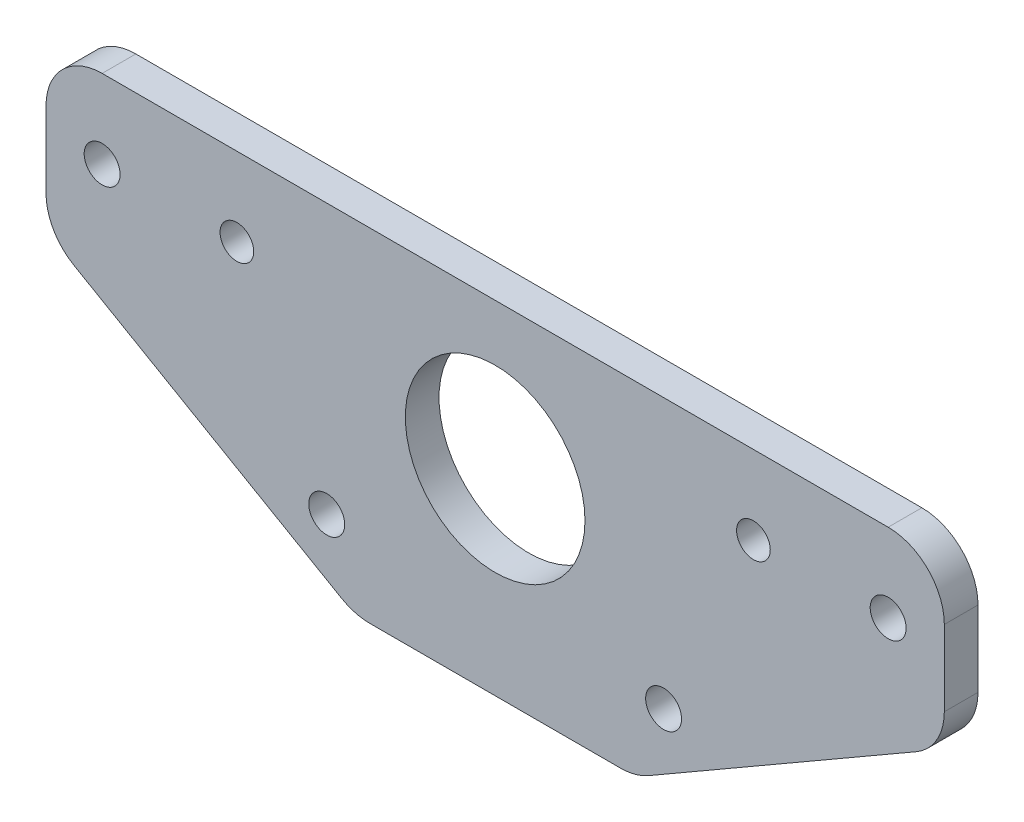
ISO-10303-21;
HEADER;
FILE_DESCRIPTION(('STEP AP214'),'2;1');
FILE_NAME('part.step','',(''),(''),'','','');
FILE_SCHEMA(('AUTOMOTIVE_DESIGN { 1 0 10303 214 1 1 1 1 }'));
ENDSEC;
DATA;
#1=APPLICATION_CONTEXT('core data for automotive mechanical design processes');
#2=APPLICATION_PROTOCOL_DEFINITION('international standard','automotive_design',2000,#1);
#3=PRODUCT_CONTEXT('',#1,'mechanical');
#4=PRODUCT('Part','Part','',(#3));
#5=PRODUCT_RELATED_PRODUCT_CATEGORY('part','',(#4));
#6=PRODUCT_DEFINITION_FORMATION('','',#4);
#7=PRODUCT_DEFINITION_CONTEXT('part definition',#1,'design');
#8=PRODUCT_DEFINITION('design','',#6,#7);
#9=PRODUCT_DEFINITION_SHAPE('','',#8);
#10=(LENGTH_UNIT() NAMED_UNIT(*) SI_UNIT(.MILLI.,.METRE.));
#11=(NAMED_UNIT(*) PLANE_ANGLE_UNIT() SI_UNIT($,.RADIAN.));
#12=(NAMED_UNIT(*) SI_UNIT($,.STERADIAN.) SOLID_ANGLE_UNIT());
#13=UNCERTAINTY_MEASURE_WITH_UNIT(LENGTH_MEASURE(1.E-05),#10,'distance_accuracy_value','');
#14=(GEOMETRIC_REPRESENTATION_CONTEXT(3) GLOBAL_UNCERTAINTY_ASSIGNED_CONTEXT((#13)) GLOBAL_UNIT_ASSIGNED_CONTEXT((#10,
#11,#12)) REPRESENTATION_CONTEXT('',''));
#15=CARTESIAN_POINT('',(0.,0.,0.));
#16=DIRECTION('',(0.,0.,1.));
#17=DIRECTION('',(1.,0.,0.));
#18=AXIS2_PLACEMENT_3D('',#15,#16,#17);
#19=CARTESIAN_POINT('',(35.,25.5,3.));
#20=DIRECTION('',(0.,0.,1.));
#21=DIRECTION('',(1.,0.,0.));
#22=AXIS2_PLACEMENT_3D('',#19,#20,#21);
#23=PLANE('',#22);
#24=CARTESIAN_POINT('',(-15.,6.50000000000001,3.));
#25=DIRECTION('',(0.,0.,1.));
#26=DIRECTION('',(1.,0.,0.));
#27=AXIS2_PLACEMENT_3D('',#24,#25,#26);
#28=CIRCLE('',#27,1.6);
#29=CARTESIAN_POINT('',(-13.4,6.50000000000001,3.));
#30=VERTEX_POINT('',#29);
#31=EDGE_CURVE('E472',#30,#30,#28,.T.);
#32=ORIENTED_EDGE('',*,*,#31,.F.);
#33=EDGE_LOOP('',(#32));
#34=FACE_BOUND('',#33,.T.);
#35=CARTESIAN_POINT('',(-35.,23.5,3.));
#36=DIRECTION('',(0.,0.,1.));
#37=DIRECTION('',(1.,0.,0.));
#38=AXIS2_PLACEMENT_3D('',#35,#36,#37);
#39=CIRCLE('',#38,1.6);
#40=CARTESIAN_POINT('',(-33.4,23.5,3.));
#41=VERTEX_POINT('',#40);
#42=EDGE_CURVE('E460',#41,#41,#39,.T.);
#43=ORIENTED_EDGE('',*,*,#42,.F.);
#44=EDGE_LOOP('',(#43));
#45=FACE_BOUND('',#44,.T.);
#46=CARTESIAN_POINT('',(-23.,23.5,3.));
#47=DIRECTION('',(0.,0.,1.));
#48=DIRECTION('',(1.,0.,0.));
#49=AXIS2_PLACEMENT_3D('',#46,#47,#48);
#50=CIRCLE('',#49,1.5);
#51=CARTESIAN_POINT('',(-21.5,23.5,3.));
#52=VERTEX_POINT('',#51);
#53=EDGE_CURVE('E446',#52,#52,#50,.T.);
#54=ORIENTED_EDGE('',*,*,#53,.F.);
#55=EDGE_LOOP('',(#54));
#56=FACE_BOUND('',#55,.T.);
#57=DIRECTION('',(0.,1.,0.));
#58=VECTOR('',#57,1.);
#59=CARTESIAN_POINT('',(-40.,15.8771324027148,3.));
#60=LINE('',#59,#58);
#61=CARTESIAN_POINT('',(-40.,18.7638837486629,3.));
#62=VERTEX_POINT('',#61);
#63=CARTESIAN_POINT('',(-40.,25.5,3.));
#64=VERTEX_POINT('',#63);
#65=EDGE_CURVE('E171',#62,#64,#60,.T.);
#66=ORIENTED_EDGE('',*,*,#65,.F.);
#67=CARTESIAN_POINT('',(-35.,18.7638837486629,3.));
#68=DIRECTION('',(0.,0.,1.));
#69=DIRECTION('',(1.,0.,0.));
#70=AXIS2_PLACEMENT_3D('',#67,#68,#69);
#71=CIRCLE('',#70,5.);
#72=CARTESIAN_POINT('',(-37.5,14.4337567297407,3.));
#73=VERTEX_POINT('',#72);
#74=EDGE_CURVE('E203',#62,#73,#71,.T.);
#75=ORIENTED_EDGE('',*,*,#74,.T.);
#76=DIRECTION('',(-0.866025403784438,0.500000000000001,0.));
#77=VECTOR('',#76,1.);
#78=CARTESIAN_POINT('',(-12.5,0.,3.));
#79=LINE('',#78,#77);
#80=CARTESIAN_POINT('',(-13.6602540378444,0.669872981077811,3.));
#81=VERTEX_POINT('',#80);
#82=EDGE_CURVE('E173',#81,#73,#79,.T.);
#83=ORIENTED_EDGE('',*,*,#82,.F.);
#84=CARTESIAN_POINT('',(-11.1602540378444,5.,3.));
#85=DIRECTION('',(0.,0.,1.));
#86=DIRECTION('',(1.,0.,0.));
#87=AXIS2_PLACEMENT_3D('',#84,#85,#86);
#88=CIRCLE('',#87,5.);
#89=CARTESIAN_POINT('',(-11.1602540378444,0.,3.));
#90=VERTEX_POINT('',#89);
#91=EDGE_CURVE('E50',#81,#90,#88,.T.);
#92=ORIENTED_EDGE('',*,*,#91,.T.);
#93=DIRECTION('',(1.,0.,0.));
#94=VECTOR('',#93,1.);
#95=CARTESIAN_POINT('',(-12.5,0.,3.));
#96=LINE('',#95,#94);
#97=CARTESIAN_POINT('',(11.1602540378444,0.,3.));
#98=VERTEX_POINT('',#97);
#99=EDGE_CURVE('E176',#90,#98,#96,.T.);
#100=ORIENTED_EDGE('',*,*,#99,.T.);
#101=CARTESIAN_POINT('',(11.1602540378444,5.,3.));
#102=DIRECTION('',(0.,0.,1.));
#103=DIRECTION('',(1.,0.,0.));
#104=AXIS2_PLACEMENT_3D('',#101,#102,#103);
#105=CIRCLE('',#104,5.);
#106=CARTESIAN_POINT('',(13.6602540378444,0.669872981077807,3.));
#107=VERTEX_POINT('',#106);
#108=EDGE_CURVE('E199',#98,#107,#105,.T.);
#109=ORIENTED_EDGE('',*,*,#108,.T.);
#110=DIRECTION('',(0.866025403784438,0.500000000000001,0.));
#111=VECTOR('',#110,1.);
#112=CARTESIAN_POINT('',(12.5,0.,3.));
#113=LINE('',#112,#111);
#114=CARTESIAN_POINT('',(37.5,14.4337567297407,3.));
#115=VERTEX_POINT('',#114);
#116=EDGE_CURVE('E159',#107,#115,#113,.T.);
#117=ORIENTED_EDGE('',*,*,#116,.T.);
#118=CARTESIAN_POINT('',(35.,18.7638837486629,3.));
#119=DIRECTION('',(0.,0.,1.));
#120=DIRECTION('',(1.,0.,0.));
#121=AXIS2_PLACEMENT_3D('',#118,#119,#120);
#122=CIRCLE('',#121,5.);
#123=CARTESIAN_POINT('',(40.,18.7638837486629,3.));
#124=VERTEX_POINT('',#123);
#125=EDGE_CURVE('E201',#115,#124,#122,.T.);
#126=ORIENTED_EDGE('',*,*,#125,.T.);
#127=DIRECTION('',(0.,1.,0.));
#128=VECTOR('',#127,1.);
#129=CARTESIAN_POINT('',(40.,15.8771324027147,3.));
#130=LINE('',#129,#128);
#131=CARTESIAN_POINT('',(40.,25.5,3.));
#132=VERTEX_POINT('',#131);
#133=EDGE_CURVE('E162',#124,#132,#130,.T.);
#134=ORIENTED_EDGE('',*,*,#133,.T.);
#135=CARTESIAN_POINT('',(35.,25.5,3.));
#136=DIRECTION('',(0.,0.,1.));
#137=DIRECTION('',(1.,0.,0.));
#138=AXIS2_PLACEMENT_3D('',#135,#136,#137);
#139=CIRCLE('',#138,5.);
#140=CARTESIAN_POINT('',(35.,30.5,3.));
#141=VERTEX_POINT('',#140);
#142=EDGE_CURVE('E137',#132,#141,#139,.T.);
#143=ORIENTED_EDGE('',*,*,#142,.T.);
#144=DIRECTION('',(-1.,0.,0.));
#145=VECTOR('',#144,1.);
#146=CARTESIAN_POINT('',(35.,30.5,3.));
#147=LINE('',#146,#145);
#148=CARTESIAN_POINT('',(-35.,30.5,3.));
#149=VERTEX_POINT('',#148);
#150=EDGE_CURVE('E165',#141,#149,#147,.T.);
#151=ORIENTED_EDGE('',*,*,#150,.T.);
#152=CARTESIAN_POINT('',(-35.,25.5,3.));
#153=DIRECTION('',(0.,0.,-1.));
#154=DIRECTION('',(-1.,0.,0.));
#155=AXIS2_PLACEMENT_3D('',#152,#153,#154);
#156=CIRCLE('',#155,5.);
#157=EDGE_CURVE('E168',#64,#149,#156,.T.);
#158=ORIENTED_EDGE('',*,*,#157,.F.);
#159=EDGE_LOOP('',(#66,#75,#83,#92,#100,#109,#117,#126,#134,#143,#151,#158));
#160=FACE_BOUND('',#159,.T.);
#161=CARTESIAN_POINT('',(0.,17.5,3.));
#162=DIRECTION('',(0.,0.,1.));
#163=DIRECTION('',(1.,0.,0.));
#164=AXIS2_PLACEMENT_3D('',#161,#162,#163);
#165=CIRCLE('',#164,8.);
#166=CARTESIAN_POINT('',(7.99999999999999,17.5,3.));
#167=VERTEX_POINT('',#166);
#168=EDGE_CURVE('E438',#167,#167,#165,.T.);
#169=ORIENTED_EDGE('',*,*,#168,.F.);
#170=EDGE_LOOP('',(#169));
#171=FACE_BOUND('',#170,.T.);
#172=CARTESIAN_POINT('',(23.,23.5,3.));
#173=DIRECTION('',(0.,0.,1.));
#174=DIRECTION('',(1.,0.,0.));
#175=AXIS2_PLACEMENT_3D('',#172,#173,#174);
#176=CIRCLE('',#175,1.5);
#177=CARTESIAN_POINT('',(24.5,23.5,3.));
#178=VERTEX_POINT('',#177);
#179=EDGE_CURVE('E454',#178,#178,#176,.T.);
#180=ORIENTED_EDGE('',*,*,#179,.F.);
#181=EDGE_LOOP('',(#180));
#182=FACE_BOUND('',#181,.T.);
#183=CARTESIAN_POINT('',(35.,23.5,3.));
#184=DIRECTION('',(0.,0.,1.));
#185=DIRECTION('',(1.,0.,0.));
#186=AXIS2_PLACEMENT_3D('',#183,#184,#185);
#187=CIRCLE('',#186,1.6);
#188=CARTESIAN_POINT('',(36.6,23.5,3.));
#189=VERTEX_POINT('',#188);
#190=EDGE_CURVE('E466',#189,#189,#187,.T.);
#191=ORIENTED_EDGE('',*,*,#190,.F.);
#192=EDGE_LOOP('',(#191));
#193=FACE_BOUND('',#192,.T.);
#194=CARTESIAN_POINT('',(15.,6.50000000000001,3.));
#195=DIRECTION('',(0.,0.,1.));
#196=DIRECTION('',(1.,0.,0.));
#197=AXIS2_PLACEMENT_3D('',#194,#195,#196);
#198=CIRCLE('',#197,1.6);
#199=CARTESIAN_POINT('',(16.6,6.50000000000001,3.));
#200=VERTEX_POINT('',#199);
#201=EDGE_CURVE('E478',#200,#200,#198,.T.);
#202=ORIENTED_EDGE('',*,*,#201,.F.);
#203=EDGE_LOOP('',(#202));
#204=FACE_BOUND('',#203,.T.);
#205=ADVANCED_FACE('F30',(#34,#45,#56,#160,#171,#182,#193,#204),#23,.T.);
#206=CARTESIAN_POINT('',(35.,25.5,0.));
#207=DIRECTION('',(0.,0.,1.));
#208=DIRECTION('',(1.,0.,0.));
#209=AXIS2_PLACEMENT_3D('',#206,#207,#208);
#210=PLANE('',#209);
#211=CARTESIAN_POINT('',(-15.,6.50000000000001,0.));
#212=DIRECTION('',(0.,0.,1.));
#213=DIRECTION('',(1.,0.,0.));
#214=AXIS2_PLACEMENT_3D('',#211,#212,#213);
#215=CIRCLE('',#214,1.6);
#216=CARTESIAN_POINT('',(-13.4,6.50000000000001,0.));
#217=VERTEX_POINT('',#216);
#218=EDGE_CURVE('E469',#217,#217,#215,.T.);
#219=ORIENTED_EDGE('',*,*,#218,.T.);
#220=EDGE_LOOP('',(#219));
#221=FACE_BOUND('',#220,.T.);
#222=CARTESIAN_POINT('',(-35.,23.5,0.));
#223=DIRECTION('',(0.,0.,1.));
#224=DIRECTION('',(1.,0.,0.));
#225=AXIS2_PLACEMENT_3D('',#222,#223,#224);
#226=CIRCLE('',#225,1.6);
#227=CARTESIAN_POINT('',(-33.4,23.5,0.));
#228=VERTEX_POINT('',#227);
#229=EDGE_CURVE('E457',#228,#228,#226,.T.);
#230=ORIENTED_EDGE('',*,*,#229,.T.);
#231=EDGE_LOOP('',(#230));
#232=FACE_BOUND('',#231,.T.);
#233=CARTESIAN_POINT('',(-23.,23.5,0.));
#234=DIRECTION('',(0.,0.,1.));
#235=DIRECTION('',(1.,0.,0.));
#236=AXIS2_PLACEMENT_3D('',#233,#234,#235);
#237=CIRCLE('',#236,1.5);
#238=CARTESIAN_POINT('',(-21.5,23.5,0.));
#239=VERTEX_POINT('',#238);
#240=EDGE_CURVE('E442',#239,#239,#237,.T.);
#241=ORIENTED_EDGE('',*,*,#240,.T.);
#242=EDGE_LOOP('',(#241));
#243=FACE_BOUND('',#242,.T.);
#244=DIRECTION('',(-0.866025403784438,0.500000000000001,0.));
#245=VECTOR('',#244,1.);
#246=CARTESIAN_POINT('',(-12.5,0.,0.));
#247=LINE('',#246,#245);
#248=CARTESIAN_POINT('',(-13.6602540378444,0.669872981077811,0.));
#249=VERTEX_POINT('',#248);
#250=CARTESIAN_POINT('',(-37.5,14.4337567297407,0.));
#251=VERTEX_POINT('',#250);
#252=EDGE_CURVE('E155',#249,#251,#247,.T.);
#253=ORIENTED_EDGE('',*,*,#252,.T.);
#254=CARTESIAN_POINT('',(-35.,18.7638837486629,0.));
#255=DIRECTION('',(0.,0.,1.));
#256=DIRECTION('',(1.,0.,0.));
#257=AXIS2_PLACEMENT_3D('',#254,#255,#256);
#258=CIRCLE('',#257,5.);
#259=CARTESIAN_POINT('',(-40.,18.7638837486629,0.));
#260=VERTEX_POINT('',#259);
#261=EDGE_CURVE('E194',#251,#260,#258,.F.);
#262=ORIENTED_EDGE('',*,*,#261,.T.);
#263=DIRECTION('',(0.,1.,0.));
#264=VECTOR('',#263,1.);
#265=CARTESIAN_POINT('',(-40.,15.8771324027148,0.));
#266=LINE('',#265,#264);
#267=CARTESIAN_POINT('',(-40.,25.5,0.));
#268=VERTEX_POINT('',#267);
#269=EDGE_CURVE('E153',#260,#268,#266,.T.);
#270=ORIENTED_EDGE('',*,*,#269,.T.);
#271=CARTESIAN_POINT('',(-35.,25.5,0.));
#272=DIRECTION('',(0.,0.,-1.));
#273=DIRECTION('',(-1.,0.,0.));
#274=AXIS2_PLACEMENT_3D('',#271,#272,#273);
#275=CIRCLE('',#274,5.);
#276=CARTESIAN_POINT('',(-35.,30.5,0.));
#277=VERTEX_POINT('',#276);
#278=EDGE_CURVE('E148',#268,#277,#275,.T.);
#279=ORIENTED_EDGE('',*,*,#278,.T.);
#280=DIRECTION('',(-1.,0.,0.));
#281=VECTOR('',#280,1.);
#282=CARTESIAN_POINT('',(35.,30.5,0.));
#283=LINE('',#282,#281);
#284=CARTESIAN_POINT('',(35.,30.5,0.));
#285=VERTEX_POINT('',#284);
#286=EDGE_CURVE('E146',#285,#277,#283,.T.);
#287=ORIENTED_EDGE('',*,*,#286,.F.);
#288=CARTESIAN_POINT('',(35.,25.5,0.));
#289=DIRECTION('',(0.,0.,1.));
#290=DIRECTION('',(1.,0.,0.));
#291=AXIS2_PLACEMENT_3D('',#288,#289,#290);
#292=CIRCLE('',#291,5.);
#293=CARTESIAN_POINT('',(40.,25.5,0.));
#294=VERTEX_POINT('',#293);
#295=EDGE_CURVE('E129',#294,#285,#292,.T.);
#296=ORIENTED_EDGE('',*,*,#295,.F.);
#297=DIRECTION('',(0.,1.,0.));
#298=VECTOR('',#297,1.);
#299=CARTESIAN_POINT('',(40.,15.8771324027147,0.));
#300=LINE('',#299,#298);
#301=CARTESIAN_POINT('',(40.,18.7638837486629,0.));
#302=VERTEX_POINT('',#301);
#303=EDGE_CURVE('E120',#302,#294,#300,.T.);
#304=ORIENTED_EDGE('',*,*,#303,.F.);
#305=CARTESIAN_POINT('',(35.,18.7638837486629,0.));
#306=DIRECTION('',(0.,0.,1.));
#307=DIRECTION('',(1.,0.,0.));
#308=AXIS2_PLACEMENT_3D('',#305,#306,#307);
#309=CIRCLE('',#308,5.);
#310=CARTESIAN_POINT('',(37.5,14.4337567297407,0.));
#311=VERTEX_POINT('',#310);
#312=EDGE_CURVE('E192',#302,#311,#309,.F.);
#313=ORIENTED_EDGE('',*,*,#312,.T.);
#314=DIRECTION('',(0.866025403784438,0.500000000000001,0.));
#315=VECTOR('',#314,1.);
#316=CARTESIAN_POINT('',(12.5,0.,0.));
#317=LINE('',#316,#315);
#318=CARTESIAN_POINT('',(13.6602540378444,0.669872981077807,0.));
#319=VERTEX_POINT('',#318);
#320=EDGE_CURVE('E130',#319,#311,#317,.T.);
#321=ORIENTED_EDGE('',*,*,#320,.F.);
#322=CARTESIAN_POINT('',(11.1602540378444,5.,0.));
#323=DIRECTION('',(0.,0.,1.));
#324=DIRECTION('',(1.,0.,0.));
#325=AXIS2_PLACEMENT_3D('',#322,#323,#324);
#326=CIRCLE('',#325,5.);
#327=CARTESIAN_POINT('',(11.1602540378444,0.,0.));
#328=VERTEX_POINT('',#327);
#329=EDGE_CURVE('E190',#319,#328,#326,.F.);
#330=ORIENTED_EDGE('',*,*,#329,.T.);
#331=DIRECTION('',(1.,0.,0.));
#332=VECTOR('',#331,1.);
#333=CARTESIAN_POINT('',(-12.5,0.,0.));
#334=LINE('',#333,#332);
#335=CARTESIAN_POINT('',(-11.1602540378444,0.,0.));
#336=VERTEX_POINT('',#335);
#337=EDGE_CURVE('E157',#336,#328,#334,.T.);
#338=ORIENTED_EDGE('',*,*,#337,.F.);
#339=CARTESIAN_POINT('',(-11.1602540378444,5.,0.));
#340=DIRECTION('',(0.,0.,1.));
#341=DIRECTION('',(1.,0.,0.));
#342=AXIS2_PLACEMENT_3D('',#339,#340,#341);
#343=CIRCLE('',#342,5.);
#344=EDGE_CURVE('E188',#336,#249,#343,.F.);
#345=ORIENTED_EDGE('',*,*,#344,.T.);
#346=EDGE_LOOP('',(#253,#262,#270,#279,#287,#296,#304,#313,#321,#330,#338,#345));
#347=FACE_BOUND('',#346,.T.);
#348=CARTESIAN_POINT('',(0.,17.5,0.));
#349=DIRECTION('',(0.,0.,1.));
#350=DIRECTION('',(1.,0.,0.));
#351=AXIS2_PLACEMENT_3D('',#348,#349,#350);
#352=CIRCLE('',#351,8.);
#353=CARTESIAN_POINT('',(7.99999999999999,17.5,0.));
#354=VERTEX_POINT('',#353);
#355=EDGE_CURVE('E441',#354,#354,#352,.T.);
#356=ORIENTED_EDGE('',*,*,#355,.T.);
#357=EDGE_LOOP('',(#356));
#358=FACE_BOUND('',#357,.T.);
#359=CARTESIAN_POINT('',(23.,23.5,0.));
#360=DIRECTION('',(0.,0.,1.));
#361=DIRECTION('',(1.,0.,0.));
#362=AXIS2_PLACEMENT_3D('',#359,#360,#361);
#363=CIRCLE('',#362,1.5);
#364=CARTESIAN_POINT('',(24.5,23.5,0.));
#365=VERTEX_POINT('',#364);
#366=EDGE_CURVE('E451',#365,#365,#363,.T.);
#367=ORIENTED_EDGE('',*,*,#366,.T.);
#368=EDGE_LOOP('',(#367));
#369=FACE_BOUND('',#368,.T.);
#370=CARTESIAN_POINT('',(35.,23.5,0.));
#371=DIRECTION('',(0.,0.,1.));
#372=DIRECTION('',(1.,0.,0.));
#373=AXIS2_PLACEMENT_3D('',#370,#371,#372);
#374=CIRCLE('',#373,1.6);
#375=CARTESIAN_POINT('',(36.6,23.5,0.));
#376=VERTEX_POINT('',#375);
#377=EDGE_CURVE('E463',#376,#376,#374,.T.);
#378=ORIENTED_EDGE('',*,*,#377,.T.);
#379=EDGE_LOOP('',(#378));
#380=FACE_BOUND('',#379,.T.);
#381=CARTESIAN_POINT('',(15.,6.50000000000001,0.));
#382=DIRECTION('',(0.,0.,1.));
#383=DIRECTION('',(1.,0.,0.));
#384=AXIS2_PLACEMENT_3D('',#381,#382,#383);
#385=CIRCLE('',#384,1.6);
#386=CARTESIAN_POINT('',(16.6,6.50000000000001,0.));
#387=VERTEX_POINT('',#386);
#388=EDGE_CURVE('E475',#387,#387,#385,.T.);
#389=ORIENTED_EDGE('',*,*,#388,.T.);
#390=EDGE_LOOP('',(#389));
#391=FACE_BOUND('',#390,.T.);
#392=ADVANCED_FACE('F142',(#221,#232,#243,#347,#358,#369,#380,#391),#210,.F.);
#393=CARTESIAN_POINT('',(12.5,0.,3.));
#394=DIRECTION('',(-0.500000000000001,0.866025403784438,0.));
#395=DIRECTION('',(-0.866025403784438,-0.500000000000001,0.));
#396=AXIS2_PLACEMENT_3D('',#393,#394,#395);
#397=PLANE('',#396);
#398=ORIENTED_EDGE('',*,*,#320,.T.);
#399=DIRECTION('',(0.,0.,-1.));
#400=VECTOR('',#399,1.);
#401=CARTESIAN_POINT('',(37.5,14.4337567297407,3.));
#402=LINE('',#401,#400);
#403=EDGE_CURVE('E209',#311,#115,#402,.F.);
#404=ORIENTED_EDGE('',*,*,#403,.T.);
#405=ORIENTED_EDGE('',*,*,#116,.F.);
#406=DIRECTION('',(0.,0.,-1.));
#407=VECTOR('',#406,1.);
#408=CARTESIAN_POINT('',(13.6602540378444,0.669872981077807,3.));
#409=LINE('',#408,#407);
#410=EDGE_CURVE('E206',#107,#319,#409,.T.);
#411=ORIENTED_EDGE('',*,*,#410,.T.);
#412=EDGE_LOOP('',(#398,#404,#405,#411));
#413=FACE_BOUND('',#412,.T.);
#414=ADVANCED_FACE('F224',(#413),#397,.F.);
#415=CARTESIAN_POINT('',(40.,15.8771324027147,3.));
#416=DIRECTION('',(-1.,0.,0.));
#417=DIRECTION('',(0.,0.,1.));
#418=AXIS2_PLACEMENT_3D('',#415,#416,#417);
#419=PLANE('',#418);
#420=ORIENTED_EDGE('',*,*,#133,.F.);
#421=DIRECTION('',(0.,0.,-1.));
#422=VECTOR('',#421,1.);
#423=CARTESIAN_POINT('',(40.,18.7638837486629,3.));
#424=LINE('',#423,#422);
#425=EDGE_CURVE('E126',#124,#302,#424,.T.);
#426=ORIENTED_EDGE('',*,*,#425,.T.);
#427=ORIENTED_EDGE('',*,*,#303,.T.);
#428=DIRECTION('',(0.,0.,-1.));
#429=VECTOR('',#428,1.);
#430=CARTESIAN_POINT('',(40.,25.5,3.));
#431=LINE('',#430,#429);
#432=EDGE_CURVE('E123',#132,#294,#431,.T.);
#433=ORIENTED_EDGE('',*,*,#432,.F.);
#434=EDGE_LOOP('',(#420,#426,#427,#433));
#435=FACE_BOUND('',#434,.T.);
#436=ADVANCED_FACE('F32',(#435),#419,.F.);
#437=CARTESIAN_POINT('',(35.,25.5,3.));
#438=DIRECTION('',(0.,0.,-1.));
#439=DIRECTION('',(-1.,0.,0.));
#440=AXIS2_PLACEMENT_3D('',#437,#438,#439);
#441=CYLINDRICAL_SURFACE('',#440,5.);
#442=DIRECTION('',(0.,0.,-1.));
#443=VECTOR('',#442,1.);
#444=CARTESIAN_POINT('',(35.,30.5,3.));
#445=LINE('',#444,#443);
#446=EDGE_CURVE('E139',#141,#285,#445,.T.);
#447=ORIENTED_EDGE('',*,*,#446,.F.);
#448=ORIENTED_EDGE('',*,*,#142,.F.);
#449=ORIENTED_EDGE('',*,*,#432,.T.);
#450=ORIENTED_EDGE('',*,*,#295,.T.);
#451=EDGE_LOOP('',(#447,#448,#449,#450));
#452=FACE_BOUND('',#451,.T.);
#453=ADVANCED_FACE('F134',(#452),#441,.T.);
#454=CARTESIAN_POINT('',(35.,30.5,3.));
#455=DIRECTION('',(0.,-1.,0.));
#456=DIRECTION('',(1.,0.,0.));
#457=AXIS2_PLACEMENT_3D('',#454,#455,#456);
#458=PLANE('',#457);
#459=DIRECTION('',(0.,0.,-1.));
#460=VECTOR('',#459,1.);
#461=CARTESIAN_POINT('',(-35.,30.5,3.));
#462=LINE('',#461,#460);
#463=EDGE_CURVE('E181',#149,#277,#462,.T.);
#464=ORIENTED_EDGE('',*,*,#463,.F.);
#465=ORIENTED_EDGE('',*,*,#150,.F.);
#466=ORIENTED_EDGE('',*,*,#446,.T.);
#467=ORIENTED_EDGE('',*,*,#286,.T.);
#468=EDGE_LOOP('',(#464,#465,#466,#467));
#469=FACE_BOUND('',#468,.T.);
#470=ADVANCED_FACE('F271',(#469),#458,.F.);
#471=CARTESIAN_POINT('',(-35.,25.5,3.));
#472=DIRECTION('',(0.,0.,-1.));
#473=DIRECTION('',(-1.,0.,0.));
#474=AXIS2_PLACEMENT_3D('',#471,#472,#473);
#475=CYLINDRICAL_SURFACE('',#474,5.);
#476=DIRECTION('',(0.,0.,-1.));
#477=VECTOR('',#476,1.);
#478=CARTESIAN_POINT('',(-40.,25.5,3.));
#479=LINE('',#478,#477);
#480=EDGE_CURVE('E178',#64,#268,#479,.T.);
#481=ORIENTED_EDGE('',*,*,#480,.F.);
#482=ORIENTED_EDGE('',*,*,#157,.T.);
#483=ORIENTED_EDGE('',*,*,#463,.T.);
#484=ORIENTED_EDGE('',*,*,#278,.F.);
#485=EDGE_LOOP('',(#481,#482,#483,#484));
#486=FACE_BOUND('',#485,.T.);
#487=ADVANCED_FACE('F267',(#486),#475,.T.);
#488=CARTESIAN_POINT('',(-40.,15.8771324027148,3.));
#489=DIRECTION('',(-1.,0.,0.));
#490=DIRECTION('',(0.,0.,1.));
#491=AXIS2_PLACEMENT_3D('',#488,#489,#490);
#492=PLANE('',#491);
#493=ORIENTED_EDGE('',*,*,#269,.F.);
#494=DIRECTION('',(0.,0.,-1.));
#495=VECTOR('',#494,1.);
#496=CARTESIAN_POINT('',(-40.,18.7638837486629,3.));
#497=LINE('',#496,#495);
#498=EDGE_CURVE('E196',#260,#62,#497,.F.);
#499=ORIENTED_EDGE('',*,*,#498,.T.);
#500=ORIENTED_EDGE('',*,*,#65,.T.);
#501=ORIENTED_EDGE('',*,*,#480,.T.);
#502=EDGE_LOOP('',(#493,#499,#500,#501));
#503=FACE_BOUND('',#502,.T.);
#504=ADVANCED_FACE('F263',(#503),#492,.T.);
#505=CARTESIAN_POINT('',(-12.5,0.,3.));
#506=DIRECTION('',(-0.500000000000001,-0.866025403784438,0.));
#507=DIRECTION('',(0.866025403784438,-0.500000000000001,0.));
#508=AXIS2_PLACEMENT_3D('',#505,#506,#507);
#509=PLANE('',#508);
#510=ORIENTED_EDGE('',*,*,#82,.T.);
#511=DIRECTION('',(0.,0.,-1.));
#512=VECTOR('',#511,1.);
#513=CARTESIAN_POINT('',(-37.5,14.4337567297407,3.));
#514=LINE('',#513,#512);
#515=EDGE_CURVE('E185',#73,#251,#514,.T.);
#516=ORIENTED_EDGE('',*,*,#515,.T.);
#517=ORIENTED_EDGE('',*,*,#252,.F.);
#518=DIRECTION('',(0.,0.,-1.));
#519=VECTOR('',#518,1.);
#520=CARTESIAN_POINT('',(-13.6602540378444,0.669872981077811,3.));
#521=LINE('',#520,#519);
#522=EDGE_CURVE('E138',#249,#81,#521,.F.);
#523=ORIENTED_EDGE('',*,*,#522,.T.);
#524=EDGE_LOOP('',(#510,#516,#517,#523));
#525=FACE_BOUND('',#524,.T.);
#526=ADVANCED_FACE('F260',(#525),#509,.T.);
#527=CARTESIAN_POINT('',(-12.5,0.,3.));
#528=DIRECTION('',(0.,1.,0.));
#529=DIRECTION('',(-1.,0.,0.));
#530=AXIS2_PLACEMENT_3D('',#527,#528,#529);
#531=PLANE('',#530);
#532=ORIENTED_EDGE('',*,*,#337,.T.);
#533=DIRECTION('',(0.,0.,-1.));
#534=VECTOR('',#533,1.);
#535=CARTESIAN_POINT('',(11.1602540378444,0.,3.));
#536=LINE('',#535,#534);
#537=EDGE_CURVE('E11',#328,#98,#536,.F.);
#538=ORIENTED_EDGE('',*,*,#537,.T.);
#539=ORIENTED_EDGE('',*,*,#99,.F.);
#540=DIRECTION('',(0.,0.,-1.));
#541=VECTOR('',#540,1.);
#542=CARTESIAN_POINT('',(-11.1602540378444,0.,3.));
#543=LINE('',#542,#541);
#544=EDGE_CURVE('E38',#90,#336,#543,.T.);
#545=ORIENTED_EDGE('',*,*,#544,.T.);
#546=EDGE_LOOP('',(#532,#538,#539,#545));
#547=FACE_BOUND('',#546,.T.);
#548=ADVANCED_FACE('F213',(#547),#531,.F.);
#549=CARTESIAN_POINT('',(0.,17.5,3.));
#550=DIRECTION('',(0.,0.,-1.));
#551=DIRECTION('',(-1.,0.,0.));
#552=AXIS2_PLACEMENT_3D('',#549,#550,#551);
#553=CYLINDRICAL_SURFACE('',#552,8.);
#554=ORIENTED_EDGE('',*,*,#168,.T.);
#555=EDGE_LOOP('',(#554));
#556=FACE_BOUND('',#555,.T.);
#557=ORIENTED_EDGE('',*,*,#355,.F.);
#558=EDGE_LOOP('',(#557));
#559=FACE_BOUND('',#558,.T.);
#560=ADVANCED_FACE('F259',(#556,#559),#553,.F.);
#561=CARTESIAN_POINT('',(-23.,23.5,3.));
#562=DIRECTION('',(0.,0.,1.));
#563=DIRECTION('',(1.,0.,0.));
#564=AXIS2_PLACEMENT_3D('',#561,#562,#563);
#565=CYLINDRICAL_SURFACE('',#564,1.5);
#566=ORIENTED_EDGE('',*,*,#53,.T.);
#567=EDGE_LOOP('',(#566));
#568=FACE_BOUND('',#567,.T.);
#569=ORIENTED_EDGE('',*,*,#240,.F.);
#570=EDGE_LOOP('',(#569));
#571=FACE_BOUND('',#570,.T.);
#572=ADVANCED_FACE('F368',(#568,#571),#565,.F.);
#573=CARTESIAN_POINT('',(23.,23.5,3.));
#574=DIRECTION('',(0.,0.,1.));
#575=DIRECTION('',(1.,0.,0.));
#576=AXIS2_PLACEMENT_3D('',#573,#574,#575);
#577=CYLINDRICAL_SURFACE('',#576,1.5);
#578=ORIENTED_EDGE('',*,*,#179,.T.);
#579=EDGE_LOOP('',(#578));
#580=FACE_BOUND('',#579,.T.);
#581=ORIENTED_EDGE('',*,*,#366,.F.);
#582=EDGE_LOOP('',(#581));
#583=FACE_BOUND('',#582,.T.);
#584=ADVANCED_FACE('F360',(#580,#583),#577,.F.);
#585=CARTESIAN_POINT('',(-35.,23.5,3.));
#586=DIRECTION('',(0.,0.,1.));
#587=DIRECTION('',(1.,0.,0.));
#588=AXIS2_PLACEMENT_3D('',#585,#586,#587);
#589=CYLINDRICAL_SURFACE('',#588,1.6);
#590=ORIENTED_EDGE('',*,*,#42,.T.);
#591=EDGE_LOOP('',(#590));
#592=FACE_BOUND('',#591,.T.);
#593=ORIENTED_EDGE('',*,*,#229,.F.);
#594=EDGE_LOOP('',(#593));
#595=FACE_BOUND('',#594,.T.);
#596=ADVANCED_FACE('F352',(#592,#595),#589,.F.);
#597=CARTESIAN_POINT('',(35.,23.5,3.));
#598=DIRECTION('',(0.,0.,1.));
#599=DIRECTION('',(1.,0.,0.));
#600=AXIS2_PLACEMENT_3D('',#597,#598,#599);
#601=CYLINDRICAL_SURFACE('',#600,1.6);
#602=ORIENTED_EDGE('',*,*,#190,.T.);
#603=EDGE_LOOP('',(#602));
#604=FACE_BOUND('',#603,.T.);
#605=ORIENTED_EDGE('',*,*,#377,.F.);
#606=EDGE_LOOP('',(#605));
#607=FACE_BOUND('',#606,.T.);
#608=ADVANCED_FACE('F345',(#604,#607),#601,.F.);
#609=CARTESIAN_POINT('',(-15.,6.50000000000001,3.));
#610=DIRECTION('',(0.,0.,1.));
#611=DIRECTION('',(1.,0.,0.));
#612=AXIS2_PLACEMENT_3D('',#609,#610,#611);
#613=CYLINDRICAL_SURFACE('',#612,1.6);
#614=ORIENTED_EDGE('',*,*,#31,.T.);
#615=EDGE_LOOP('',(#614));
#616=FACE_BOUND('',#615,.T.);
#617=ORIENTED_EDGE('',*,*,#218,.F.);
#618=EDGE_LOOP('',(#617));
#619=FACE_BOUND('',#618,.T.);
#620=ADVANCED_FACE('F304',(#616,#619),#613,.F.);
#621=CARTESIAN_POINT('',(15.,6.50000000000001,3.));
#622=DIRECTION('',(0.,0.,1.));
#623=DIRECTION('',(1.,0.,0.));
#624=AXIS2_PLACEMENT_3D('',#621,#622,#623);
#625=CYLINDRICAL_SURFACE('',#624,1.6);
#626=ORIENTED_EDGE('',*,*,#201,.T.);
#627=EDGE_LOOP('',(#626));
#628=FACE_BOUND('',#627,.T.);
#629=ORIENTED_EDGE('',*,*,#388,.F.);
#630=EDGE_LOOP('',(#629));
#631=FACE_BOUND('',#630,.T.);
#632=ADVANCED_FACE('F240',(#628,#631),#625,.F.);
#633=CARTESIAN_POINT('',(-35.,18.7638837486629,3.));
#634=DIRECTION('',(0.,0.,-1.));
#635=DIRECTION('',(-1.,0.,0.));
#636=AXIS2_PLACEMENT_3D('',#633,#634,#635);
#637=CYLINDRICAL_SURFACE('',#636,5.);
#638=ORIENTED_EDGE('',*,*,#74,.F.);
#639=ORIENTED_EDGE('',*,*,#498,.F.);
#640=ORIENTED_EDGE('',*,*,#261,.F.);
#641=ORIENTED_EDGE('',*,*,#515,.F.);
#642=EDGE_LOOP('',(#638,#639,#640,#641));
#643=FACE_BOUND('',#642,.T.);
#644=ADVANCED_FACE('F232',(#643),#637,.T.);
#645=CARTESIAN_POINT('',(35.,18.7638837486629,3.));
#646=DIRECTION('',(0.,0.,-1.));
#647=DIRECTION('',(-1.,0.,0.));
#648=AXIS2_PLACEMENT_3D('',#645,#646,#647);
#649=CYLINDRICAL_SURFACE('',#648,5.);
#650=ORIENTED_EDGE('',*,*,#125,.F.);
#651=ORIENTED_EDGE('',*,*,#403,.F.);
#652=ORIENTED_EDGE('',*,*,#312,.F.);
#653=ORIENTED_EDGE('',*,*,#425,.F.);
#654=EDGE_LOOP('',(#650,#651,#652,#653));
#655=FACE_BOUND('',#654,.T.);
#656=ADVANCED_FACE('F230',(#655),#649,.T.);
#657=CARTESIAN_POINT('',(11.1602540378444,5.,3.));
#658=DIRECTION('',(0.,0.,-1.));
#659=DIRECTION('',(-1.,0.,0.));
#660=AXIS2_PLACEMENT_3D('',#657,#658,#659);
#661=CYLINDRICAL_SURFACE('',#660,5.);
#662=ORIENTED_EDGE('',*,*,#108,.F.);
#663=ORIENTED_EDGE('',*,*,#537,.F.);
#664=ORIENTED_EDGE('',*,*,#329,.F.);
#665=ORIENTED_EDGE('',*,*,#410,.F.);
#666=EDGE_LOOP('',(#662,#663,#664,#665));
#667=FACE_BOUND('',#666,.T.);
#668=ADVANCED_FACE('F221',(#667),#661,.T.);
#669=CARTESIAN_POINT('',(-11.1602540378444,5.,3.));
#670=DIRECTION('',(0.,0.,1.));
#671=DIRECTION('',(1.,0.,0.));
#672=AXIS2_PLACEMENT_3D('',#669,#670,#671);
#673=CYLINDRICAL_SURFACE('',#672,5.);
#674=ORIENTED_EDGE('',*,*,#91,.F.);
#675=ORIENTED_EDGE('',*,*,#522,.F.);
#676=ORIENTED_EDGE('',*,*,#344,.F.);
#677=ORIENTED_EDGE('',*,*,#544,.F.);
#678=EDGE_LOOP('',(#674,#675,#676,#677));
#679=FACE_BOUND('',#678,.T.);
#680=ADVANCED_FACE('F238',(#679),#673,.T.);
#681=CLOSED_SHELL('',(#205,#392,#414,#436,#453,#470,#487,#504,#526,#548,#560,#572,#584,#596,
#608,#620,#632,#644,#656,#668,#680));
#682=MANIFOLD_SOLID_BREP('B2',#681);
#683=ADVANCED_BREP_SHAPE_REPRESENTATION('',(#18,#682),#14);
#684=SHAPE_DEFINITION_REPRESENTATION(#9,#683);
ENDSEC;
END-ISO-10303-21;
